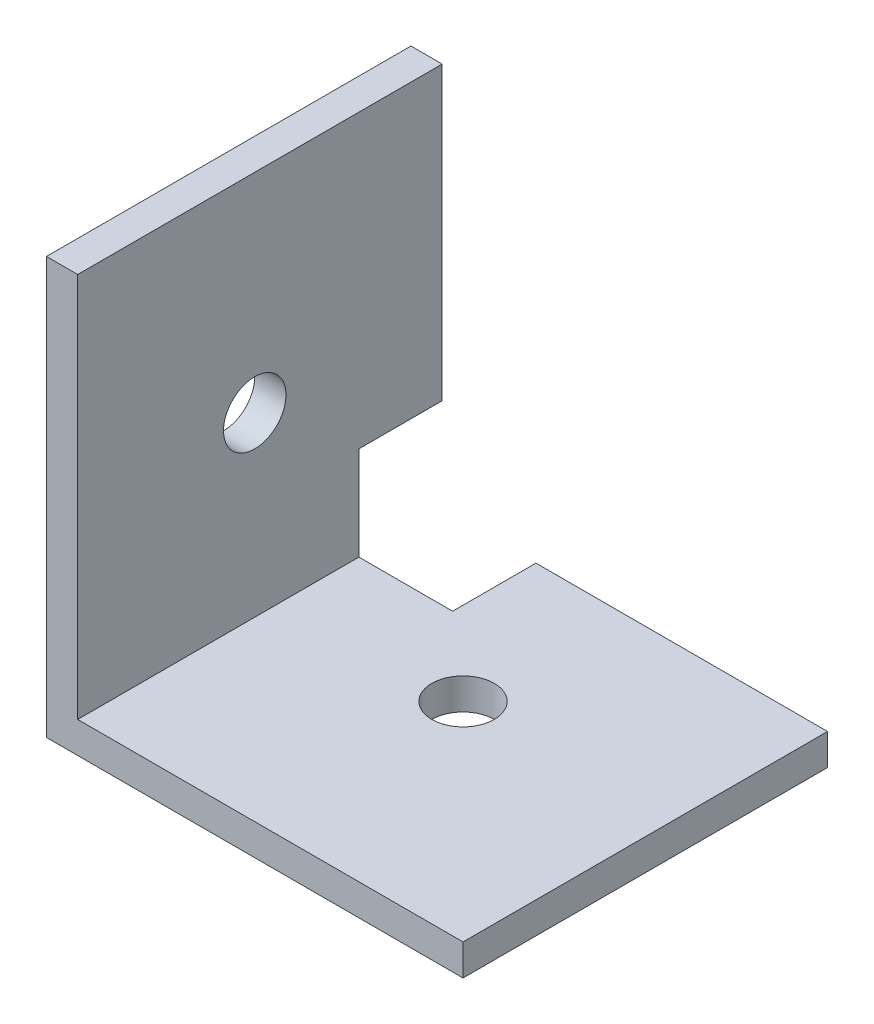
ISO-10303-21;
HEADER;
FILE_DESCRIPTION(('STEP AP214'),'2;1');
FILE_NAME('part.step','',(''),(''),'','','');
FILE_SCHEMA(('AUTOMOTIVE_DESIGN { 1 0 10303 214 1 1 1 1 }'));
ENDSEC;
DATA;
#1=APPLICATION_CONTEXT('core data for automotive mechanical design processes');
#2=APPLICATION_PROTOCOL_DEFINITION('international standard','automotive_design',2000,#1);
#3=PRODUCT_CONTEXT('',#1,'mechanical');
#4=PRODUCT('Part','Part','',(#3));
#5=PRODUCT_RELATED_PRODUCT_CATEGORY('part','',(#4));
#6=PRODUCT_DEFINITION_FORMATION('','',#4);
#7=PRODUCT_DEFINITION_CONTEXT('part definition',#1,'design');
#8=PRODUCT_DEFINITION('design','',#6,#7);
#9=PRODUCT_DEFINITION_SHAPE('','',#8);
#10=(LENGTH_UNIT() NAMED_UNIT(*) SI_UNIT(.MILLI.,.METRE.));
#11=(NAMED_UNIT(*) PLANE_ANGLE_UNIT() SI_UNIT($,.RADIAN.));
#12=(NAMED_UNIT(*) SI_UNIT($,.STERADIAN.) SOLID_ANGLE_UNIT());
#13=UNCERTAINTY_MEASURE_WITH_UNIT(LENGTH_MEASURE(1.E-05),#10,'distance_accuracy_value','');
#14=(GEOMETRIC_REPRESENTATION_CONTEXT(3) GLOBAL_UNCERTAINTY_ASSIGNED_CONTEXT((#13)) GLOBAL_UNIT_ASSIGNED_CONTEXT((#10,
#11,#12)) REPRESENTATION_CONTEXT('',''));
#15=CARTESIAN_POINT('',(0.,0.,0.));
#16=DIRECTION('',(0.,0.,1.));
#17=DIRECTION('',(1.,0.,0.));
#18=AXIS2_PLACEMENT_3D('',#15,#16,#17);
#19=CARTESIAN_POINT('',(0.,0.,0.));
#20=DIRECTION('',(0.,0.,1.));
#21=DIRECTION('',(1.,0.,0.));
#22=AXIS2_PLACEMENT_3D('',#19,#20,#21);
#23=PLANE('',#22);
#24=DIRECTION('',(0.,1.,0.));
#25=VECTOR('',#24,1.);
#26=CARTESIAN_POINT('',(1.5,1.5,0.));
#27=LINE('',#26,#25);
#28=CARTESIAN_POINT('',(1.5,6.,0.));
#29=VERTEX_POINT('',#28);
#30=CARTESIAN_POINT('',(1.5,20.,0.));
#31=VERTEX_POINT('',#30);
#32=EDGE_CURVE('E133',#29,#31,#27,.T.);
#33=ORIENTED_EDGE('',*,*,#32,.F.);
#34=DIRECTION('',(-1.,0.,0.));
#35=VECTOR('',#34,1.);
#36=CARTESIAN_POINT('',(0.,6.,0.));
#37=LINE('',#36,#35);
#38=CARTESIAN_POINT('',(0.,6.,0.));
#39=VERTEX_POINT('',#38);
#40=EDGE_CURVE('E39',#29,#39,#37,.T.);
#41=ORIENTED_EDGE('',*,*,#40,.T.);
#42=DIRECTION('',(0.,-1.,0.));
#43=VECTOR('',#42,1.);
#44=CARTESIAN_POINT('',(0.,20.,0.));
#45=LINE('',#44,#43);
#46=CARTESIAN_POINT('',(0.,20.,0.));
#47=VERTEX_POINT('',#46);
#48=EDGE_CURVE('E122',#47,#39,#45,.T.);
#49=ORIENTED_EDGE('',*,*,#48,.F.);
#50=DIRECTION('',(-1.,0.,0.));
#51=VECTOR('',#50,1.);
#52=CARTESIAN_POINT('',(1.5,20.,0.));
#53=LINE('',#52,#51);
#54=EDGE_CURVE('E76',#31,#47,#53,.T.);
#55=ORIENTED_EDGE('',*,*,#54,.F.);
#56=EDGE_LOOP('',(#33,#41,#49,#55));
#57=FACE_BOUND('',#56,.T.);
#58=ADVANCED_FACE('F31',(#57),#23,.F.);
#59=CARTESIAN_POINT('',(0.,20.,17.5));
#60=DIRECTION('',(1.,0.,0.));
#61=DIRECTION('',(0.,1.,0.));
#62=AXIS2_PLACEMENT_3D('',#59,#60,#61);
#63=PLANE('',#62);
#64=CARTESIAN_POINT('',(0.,10.,9.));
#65=DIRECTION('',(1.,0.,0.));
#66=DIRECTION('',(0.,1.,0.));
#67=AXIS2_PLACEMENT_3D('',#64,#65,#66);
#68=CIRCLE('',#67,1.5);
#69=CARTESIAN_POINT('',(0.,11.5,9.));
#70=VERTEX_POINT('',#69);
#71=EDGE_CURVE('E210',#70,#70,#68,.T.);
#72=ORIENTED_EDGE('',*,*,#71,.T.);
#73=EDGE_LOOP('',(#72));
#74=FACE_BOUND('',#73,.T.);
#75=ORIENTED_EDGE('',*,*,#48,.T.);
#76=DIRECTION('',(0.,0.,-1.));
#77=VECTOR('',#76,1.);
#78=CARTESIAN_POINT('',(0.,6.,0.));
#79=LINE('',#78,#77);
#80=CARTESIAN_POINT('',(0.,6.,4.));
#81=VERTEX_POINT('',#80);
#82=EDGE_CURVE('E163',#81,#39,#79,.T.);
#83=ORIENTED_EDGE('',*,*,#82,.F.);
#84=DIRECTION('',(0.,1.,0.));
#85=VECTOR('',#84,1.);
#86=CARTESIAN_POINT('',(0.,0.,4.));
#87=LINE('',#86,#85);
#88=CARTESIAN_POINT('',(0.,0.,4.));
#89=VERTEX_POINT('',#88);
#90=EDGE_CURVE('E230',#89,#81,#87,.T.);
#91=ORIENTED_EDGE('',*,*,#90,.F.);
#92=DIRECTION('',(0.,0.,-1.));
#93=VECTOR('',#92,1.);
#94=CARTESIAN_POINT('',(0.,0.,17.5));
#95=LINE('',#94,#93);
#96=CARTESIAN_POINT('',(0.,0.,17.5));
#97=VERTEX_POINT('',#96);
#98=EDGE_CURVE('E143',#97,#89,#95,.T.);
#99=ORIENTED_EDGE('',*,*,#98,.F.);
#100=DIRECTION('',(0.,-1.,0.));
#101=VECTOR('',#100,1.);
#102=CARTESIAN_POINT('',(0.,20.,17.5));
#103=LINE('',#102,#101);
#104=CARTESIAN_POINT('',(0.,20.,17.5));
#105=VERTEX_POINT('',#104);
#106=EDGE_CURVE('E136',#105,#97,#103,.T.);
#107=ORIENTED_EDGE('',*,*,#106,.F.);
#108=DIRECTION('',(0.,0.,-1.));
#109=VECTOR('',#108,1.);
#110=CARTESIAN_POINT('',(0.,20.,17.5));
#111=LINE('',#110,#109);
#112=EDGE_CURVE('E118',#105,#47,#111,.T.);
#113=ORIENTED_EDGE('',*,*,#112,.T.);
#114=EDGE_LOOP('',(#75,#83,#91,#99,#107,#113));
#115=FACE_BOUND('',#114,.T.);
#116=ADVANCED_FACE('F33',(#74,#115),#63,.F.);
#117=CARTESIAN_POINT('',(0.,0.,17.5));
#118=DIRECTION('',(0.,1.,0.));
#119=DIRECTION('',(0.,0.,1.));
#120=AXIS2_PLACEMENT_3D('',#117,#118,#119);
#121=PLANE('',#120);
#122=CARTESIAN_POINT('',(10.,0.,7.5));
#123=DIRECTION('',(0.,1.,0.));
#124=DIRECTION('',(-1.,0.,0.));
#125=AXIS2_PLACEMENT_3D('',#122,#123,#124);
#126=CIRCLE('',#125,1.5);
#127=CARTESIAN_POINT('',(8.5,0.,7.5));
#128=VERTEX_POINT('',#127);
#129=EDGE_CURVE('E126',#128,#128,#126,.T.);
#130=ORIENTED_EDGE('',*,*,#129,.T.);
#131=EDGE_LOOP('',(#130));
#132=FACE_BOUND('',#131,.T.);
#133=ORIENTED_EDGE('',*,*,#98,.T.);
#134=DIRECTION('',(-1.,0.,0.));
#135=VECTOR('',#134,1.);
#136=CARTESIAN_POINT('',(6.,0.,4.));
#137=LINE('',#136,#135);
#138=CARTESIAN_POINT('',(6.,0.,4.));
#139=VERTEX_POINT('',#138);
#140=EDGE_CURVE('E223',#139,#89,#137,.T.);
#141=ORIENTED_EDGE('',*,*,#140,.F.);
#142=DIRECTION('',(0.,0.,1.));
#143=VECTOR('',#142,1.);
#144=CARTESIAN_POINT('',(6.,0.,0.));
#145=LINE('',#144,#143);
#146=CARTESIAN_POINT('',(6.,0.,0.));
#147=VERTEX_POINT('',#146);
#148=EDGE_CURVE('E201',#147,#139,#145,.T.);
#149=ORIENTED_EDGE('',*,*,#148,.F.);
#150=DIRECTION('',(1.,0.,0.));
#151=VECTOR('',#150,1.);
#152=CARTESIAN_POINT('',(0.,0.,0.));
#153=LINE('',#152,#151);
#154=CARTESIAN_POINT('',(20.,0.,0.));
#155=VERTEX_POINT('',#154);
#156=EDGE_CURVE('E125',#147,#155,#153,.T.);
#157=ORIENTED_EDGE('',*,*,#156,.T.);
#158=DIRECTION('',(0.,0.,-1.));
#159=VECTOR('',#158,1.);
#160=CARTESIAN_POINT('',(20.,0.,17.5));
#161=LINE('',#160,#159);
#162=CARTESIAN_POINT('',(20.,0.,17.5));
#163=VERTEX_POINT('',#162);
#164=EDGE_CURVE('E140',#163,#155,#161,.T.);
#165=ORIENTED_EDGE('',*,*,#164,.F.);
#166=DIRECTION('',(1.,0.,0.));
#167=VECTOR('',#166,1.);
#168=CARTESIAN_POINT('',(0.,0.,17.5));
#169=LINE('',#168,#167);
#170=EDGE_CURVE('E85',#97,#163,#169,.T.);
#171=ORIENTED_EDGE('',*,*,#170,.F.);
#172=EDGE_LOOP('',(#133,#141,#149,#157,#165,#171));
#173=FACE_BOUND('',#172,.T.);
#174=ADVANCED_FACE('F182',(#132,#173),#121,.F.);
#175=CARTESIAN_POINT('',(20.,0.,17.5));
#176=DIRECTION('',(-1.,0.,0.));
#177=DIRECTION('',(0.,0.,1.));
#178=AXIS2_PLACEMENT_3D('',#175,#176,#177);
#179=PLANE('',#178);
#180=DIRECTION('',(0.,1.,0.));
#181=VECTOR('',#180,1.);
#182=CARTESIAN_POINT('',(20.,0.,0.));
#183=LINE('',#182,#181);
#184=CARTESIAN_POINT('',(20.,1.5,0.));
#185=VERTEX_POINT('',#184);
#186=EDGE_CURVE('E128',#155,#185,#183,.T.);
#187=ORIENTED_EDGE('',*,*,#186,.T.);
#188=DIRECTION('',(0.,0.,-1.));
#189=VECTOR('',#188,1.);
#190=CARTESIAN_POINT('',(20.,1.5,17.5));
#191=LINE('',#190,#189);
#192=CARTESIAN_POINT('',(20.,1.5,17.5));
#193=VERTEX_POINT('',#192);
#194=EDGE_CURVE('E113',#193,#185,#191,.T.);
#195=ORIENTED_EDGE('',*,*,#194,.F.);
#196=DIRECTION('',(0.,1.,0.));
#197=VECTOR('',#196,1.);
#198=CARTESIAN_POINT('',(20.,0.,17.5));
#199=LINE('',#198,#197);
#200=EDGE_CURVE('E101',#163,#193,#199,.T.);
#201=ORIENTED_EDGE('',*,*,#200,.F.);
#202=ORIENTED_EDGE('',*,*,#164,.T.);
#203=EDGE_LOOP('',(#187,#195,#201,#202));
#204=FACE_BOUND('',#203,.T.);
#205=ADVANCED_FACE('F203',(#204),#179,.F.);
#206=CARTESIAN_POINT('',(20.,1.5,17.5));
#207=DIRECTION('',(0.,-1.,0.));
#208=DIRECTION('',(1.,0.,0.));
#209=AXIS2_PLACEMENT_3D('',#206,#207,#208);
#210=PLANE('',#209);
#211=CARTESIAN_POINT('',(10.,1.5,7.5));
#212=DIRECTION('',(0.,1.,0.));
#213=DIRECTION('',(-1.,0.,0.));
#214=AXIS2_PLACEMENT_3D('',#211,#212,#213);
#215=CIRCLE('',#214,1.5);
#216=CARTESIAN_POINT('',(8.5,1.5,7.5));
#217=VERTEX_POINT('',#216);
#218=EDGE_CURVE('E207',#217,#217,#215,.T.);
#219=ORIENTED_EDGE('',*,*,#218,.F.);
#220=EDGE_LOOP('',(#219));
#221=FACE_BOUND('',#220,.T.);
#222=DIRECTION('',(0.,0.,1.));
#223=VECTOR('',#222,1.);
#224=CARTESIAN_POINT('',(6.,1.5,17.5));
#225=LINE('',#224,#223);
#226=CARTESIAN_POINT('',(6.,1.5,0.));
#227=VERTEX_POINT('',#226);
#228=CARTESIAN_POINT('',(6.,1.5,4.));
#229=VERTEX_POINT('',#228);
#230=EDGE_CURVE('E46',#227,#229,#225,.T.);
#231=ORIENTED_EDGE('',*,*,#230,.T.);
#232=DIRECTION('',(-1.,0.,0.));
#233=VECTOR('',#232,1.);
#234=CARTESIAN_POINT('',(20.,1.5,4.));
#235=LINE('',#234,#233);
#236=CARTESIAN_POINT('',(1.5,1.5,4.));
#237=VERTEX_POINT('',#236);
#238=EDGE_CURVE('E111',#229,#237,#235,.T.);
#239=ORIENTED_EDGE('',*,*,#238,.T.);
#240=DIRECTION('',(0.,0.,-1.));
#241=VECTOR('',#240,1.);
#242=CARTESIAN_POINT('',(1.5,1.5,17.5));
#243=LINE('',#242,#241);
#244=CARTESIAN_POINT('',(1.5,1.5,17.5));
#245=VERTEX_POINT('',#244);
#246=EDGE_CURVE('E108',#245,#237,#243,.T.);
#247=ORIENTED_EDGE('',*,*,#246,.F.);
#248=DIRECTION('',(-1.,0.,0.));
#249=VECTOR('',#248,1.);
#250=CARTESIAN_POINT('',(20.,1.5,17.5));
#251=LINE('',#250,#249);
#252=EDGE_CURVE('E94',#193,#245,#251,.T.);
#253=ORIENTED_EDGE('',*,*,#252,.F.);
#254=ORIENTED_EDGE('',*,*,#194,.T.);
#255=DIRECTION('',(-1.,0.,0.));
#256=VECTOR('',#255,1.);
#257=CARTESIAN_POINT('',(20.,1.5,0.));
#258=LINE('',#257,#256);
#259=EDGE_CURVE('E130',#185,#227,#258,.T.);
#260=ORIENTED_EDGE('',*,*,#259,.T.);
#261=EDGE_LOOP('',(#231,#239,#247,#253,#254,#260));
#262=FACE_BOUND('',#261,.T.);
#263=ADVANCED_FACE('F109',(#221,#262),#210,.F.);
#264=CARTESIAN_POINT('',(1.5,1.5,17.5));
#265=DIRECTION('',(-1.,0.,0.));
#266=DIRECTION('',(0.,-1.,0.));
#267=AXIS2_PLACEMENT_3D('',#264,#265,#266);
#268=PLANE('',#267);
#269=CARTESIAN_POINT('',(1.5,10.,9.));
#270=DIRECTION('',(1.,0.,0.));
#271=DIRECTION('',(0.,1.,0.));
#272=AXIS2_PLACEMENT_3D('',#269,#270,#271);
#273=CIRCLE('',#272,1.5);
#274=CARTESIAN_POINT('',(1.5,11.5,9.));
#275=VERTEX_POINT('',#274);
#276=EDGE_CURVE('E213',#275,#275,#273,.T.);
#277=ORIENTED_EDGE('',*,*,#276,.F.);
#278=EDGE_LOOP('',(#277));
#279=FACE_BOUND('',#278,.T.);
#280=DIRECTION('',(0.,1.,0.));
#281=VECTOR('',#280,1.);
#282=CARTESIAN_POINT('',(1.5,1.5,4.));
#283=LINE('',#282,#281);
#284=CARTESIAN_POINT('',(1.5,6.,4.));
#285=VERTEX_POINT('',#284);
#286=EDGE_CURVE('E11',#237,#285,#283,.T.);
#287=ORIENTED_EDGE('',*,*,#286,.T.);
#288=DIRECTION('',(0.,0.,-1.));
#289=VECTOR('',#288,1.);
#290=CARTESIAN_POINT('',(1.5,6.,17.5));
#291=LINE('',#290,#289);
#292=EDGE_CURVE('E219',#285,#29,#291,.T.);
#293=ORIENTED_EDGE('',*,*,#292,.T.);
#294=ORIENTED_EDGE('',*,*,#32,.T.);
#295=DIRECTION('',(0.,0.,-1.));
#296=VECTOR('',#295,1.);
#297=CARTESIAN_POINT('',(1.5,20.,17.5));
#298=LINE('',#297,#296);
#299=CARTESIAN_POINT('',(1.5,20.,17.5));
#300=VERTEX_POINT('',#299);
#301=EDGE_CURVE('E114',#300,#31,#298,.T.);
#302=ORIENTED_EDGE('',*,*,#301,.F.);
#303=DIRECTION('',(0.,1.,0.));
#304=VECTOR('',#303,1.);
#305=CARTESIAN_POINT('',(1.5,1.5,17.5));
#306=LINE('',#305,#304);
#307=EDGE_CURVE('E98',#245,#300,#306,.T.);
#308=ORIENTED_EDGE('',*,*,#307,.F.);
#309=ORIENTED_EDGE('',*,*,#246,.T.);
#310=EDGE_LOOP('',(#287,#293,#294,#302,#308,#309));
#311=FACE_BOUND('',#310,.T.);
#312=ADVANCED_FACE('F116',(#279,#311),#268,.F.);
#313=CARTESIAN_POINT('',(1.5,20.,17.5));
#314=DIRECTION('',(0.,-1.,0.));
#315=DIRECTION('',(0.,0.,-1.));
#316=AXIS2_PLACEMENT_3D('',#313,#314,#315);
#317=PLANE('',#316);
#318=ORIENTED_EDGE('',*,*,#54,.T.);
#319=ORIENTED_EDGE('',*,*,#112,.F.);
#320=DIRECTION('',(-1.,0.,0.));
#321=VECTOR('',#320,1.);
#322=CARTESIAN_POINT('',(1.5,20.,17.5));
#323=LINE('',#322,#321);
#324=EDGE_CURVE('E55',#300,#105,#323,.T.);
#325=ORIENTED_EDGE('',*,*,#324,.F.);
#326=ORIENTED_EDGE('',*,*,#301,.T.);
#327=EDGE_LOOP('',(#318,#319,#325,#326));
#328=FACE_BOUND('',#327,.T.);
#329=ADVANCED_FACE('F166',(#328),#317,.F.);
#330=CARTESIAN_POINT('',(0.,0.,17.5));
#331=DIRECTION('',(0.,0.,1.));
#332=DIRECTION('',(1.,0.,0.));
#333=AXIS2_PLACEMENT_3D('',#330,#331,#332);
#334=PLANE('',#333);
#335=ORIENTED_EDGE('',*,*,#106,.T.);
#336=ORIENTED_EDGE('',*,*,#170,.T.);
#337=ORIENTED_EDGE('',*,*,#200,.T.);
#338=ORIENTED_EDGE('',*,*,#252,.T.);
#339=ORIENTED_EDGE('',*,*,#307,.T.);
#340=ORIENTED_EDGE('',*,*,#324,.T.);
#341=EDGE_LOOP('',(#335,#336,#337,#338,#339,#340));
#342=FACE_BOUND('',#341,.T.);
#343=ADVANCED_FACE('F96',(#342),#334,.T.);
#344=ORIENTED_EDGE('',*,*,#156,.F.);
#345=DIRECTION('',(0.,1.,0.));
#346=VECTOR('',#345,1.);
#347=CARTESIAN_POINT('',(6.,0.,0.));
#348=LINE('',#347,#346);
#349=EDGE_CURVE('E145',#147,#227,#348,.T.);
#350=ORIENTED_EDGE('',*,*,#349,.T.);
#351=ORIENTED_EDGE('',*,*,#259,.F.);
#352=ORIENTED_EDGE('',*,*,#186,.F.);
#353=EDGE_LOOP('',(#344,#350,#351,#352));
#354=FACE_BOUND('',#353,.T.);
#355=ADVANCED_FACE('F173',(#354),#23,.F.);
#356=CARTESIAN_POINT('',(10.,0.,7.5));
#357=DIRECTION('',(0.,1.,0.));
#358=DIRECTION('',(-1.,0.,0.));
#359=AXIS2_PLACEMENT_3D('',#356,#357,#358);
#360=CYLINDRICAL_SURFACE('',#359,1.5);
#361=ORIENTED_EDGE('',*,*,#129,.F.);
#362=EDGE_LOOP('',(#361));
#363=FACE_BOUND('',#362,.T.);
#364=ORIENTED_EDGE('',*,*,#218,.T.);
#365=EDGE_LOOP('',(#364));
#366=FACE_BOUND('',#365,.T.);
#367=ADVANCED_FACE('F185',(#363,#366),#360,.F.);
#368=CARTESIAN_POINT('',(0.,10.,9.));
#369=DIRECTION('',(1.,0.,0.));
#370=DIRECTION('',(0.,1.,0.));
#371=AXIS2_PLACEMENT_3D('',#368,#369,#370);
#372=CYLINDRICAL_SURFACE('',#371,1.5);
#373=ORIENTED_EDGE('',*,*,#71,.F.);
#374=EDGE_LOOP('',(#373));
#375=FACE_BOUND('',#374,.T.);
#376=ORIENTED_EDGE('',*,*,#276,.T.);
#377=EDGE_LOOP('',(#376));
#378=FACE_BOUND('',#377,.T.);
#379=ADVANCED_FACE('F190',(#375,#378),#372,.F.);
#380=CARTESIAN_POINT('',(6.,0.,4.));
#381=DIRECTION('',(0.,0.,1.));
#382=DIRECTION('',(0.,-1.,0.));
#383=AXIS2_PLACEMENT_3D('',#380,#381,#382);
#384=PLANE('',#383);
#385=DIRECTION('',(0.,1.,0.));
#386=VECTOR('',#385,1.);
#387=CARTESIAN_POINT('',(6.,0.,4.));
#388=LINE('',#387,#386);
#389=EDGE_CURVE('E226',#139,#229,#388,.T.);
#390=ORIENTED_EDGE('',*,*,#389,.F.);
#391=ORIENTED_EDGE('',*,*,#140,.T.);
#392=ORIENTED_EDGE('',*,*,#90,.T.);
#393=DIRECTION('',(-1.,0.,0.));
#394=VECTOR('',#393,1.);
#395=CARTESIAN_POINT('',(6.,6.,4.));
#396=LINE('',#395,#394);
#397=EDGE_CURVE('E222',#285,#81,#396,.T.);
#398=ORIENTED_EDGE('',*,*,#397,.F.);
#399=ORIENTED_EDGE('',*,*,#286,.F.);
#400=ORIENTED_EDGE('',*,*,#238,.F.);
#401=EDGE_LOOP('',(#390,#391,#392,#398,#399,#400));
#402=FACE_BOUND('',#401,.T.);
#403=ADVANCED_FACE('F240',(#402),#384,.F.);
#404=CARTESIAN_POINT('',(6.,6.,0.));
#405=DIRECTION('',(0.,1.,0.));
#406=DIRECTION('',(-1.,0.,0.));
#407=AXIS2_PLACEMENT_3D('',#404,#405,#406);
#408=PLANE('',#407);
#409=ORIENTED_EDGE('',*,*,#397,.T.);
#410=ORIENTED_EDGE('',*,*,#82,.T.);
#411=ORIENTED_EDGE('',*,*,#40,.F.);
#412=ORIENTED_EDGE('',*,*,#292,.F.);
#413=EDGE_LOOP('',(#409,#410,#411,#412));
#414=FACE_BOUND('',#413,.T.);
#415=ADVANCED_FACE('F248',(#414),#408,.F.);
#416=CARTESIAN_POINT('',(6.,6.,0.));
#417=DIRECTION('',(1.,0.,0.));
#418=DIRECTION('',(0.,1.,0.));
#419=AXIS2_PLACEMENT_3D('',#416,#417,#418);
#420=PLANE('',#419);
#421=ORIENTED_EDGE('',*,*,#349,.F.);
#422=ORIENTED_EDGE('',*,*,#148,.T.);
#423=ORIENTED_EDGE('',*,*,#389,.T.);
#424=ORIENTED_EDGE('',*,*,#230,.F.);
#425=EDGE_LOOP('',(#421,#422,#423,#424));
#426=FACE_BOUND('',#425,.T.);
#427=ADVANCED_FACE('F234',(#426),#420,.F.);
#428=CLOSED_SHELL('',(#58,#116,#174,#205,#263,#312,#329,#343,#355,#367,#379,#403,#415,#427));
#429=MANIFOLD_SOLID_BREP('B2',#428);
#430=ADVANCED_BREP_SHAPE_REPRESENTATION('',(#18,#429),#14);
#431=SHAPE_DEFINITION_REPRESENTATION(#9,#430);
ENDSEC;
END-ISO-10303-21;
